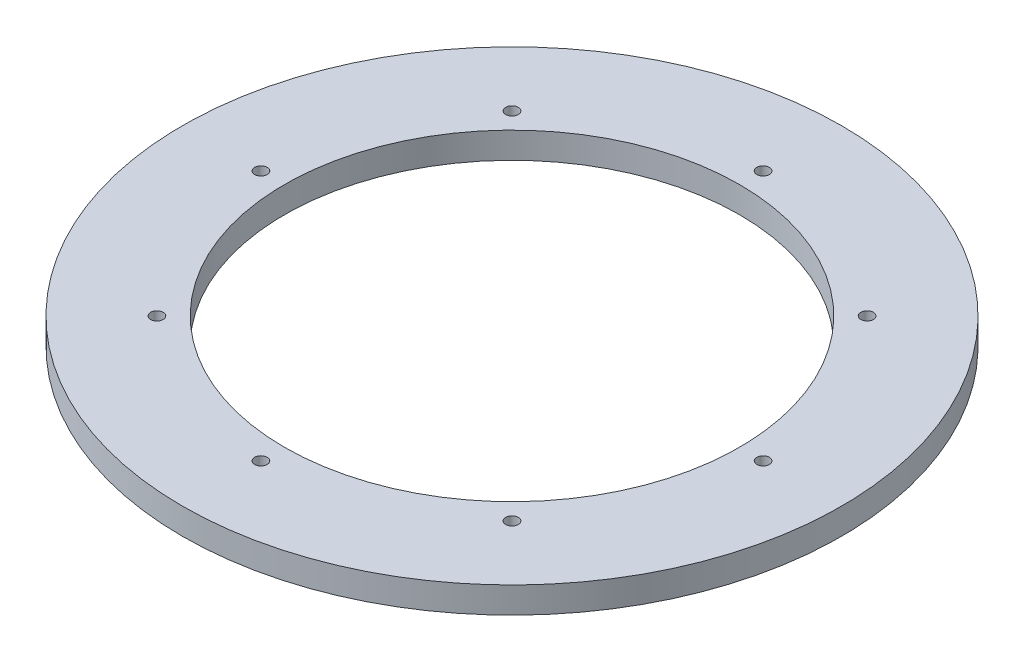
ISO-10303-21;
HEADER;
FILE_DESCRIPTION(('STEP AP214'),'2;1');
FILE_NAME('part.step','',(''),(''),'','','');
FILE_SCHEMA(('AUTOMOTIVE_DESIGN { 1 0 10303 214 1 1 1 1 }'));
ENDSEC;
DATA;
#1=APPLICATION_CONTEXT('core data for automotive mechanical design processes');
#2=APPLICATION_PROTOCOL_DEFINITION('international standard','automotive_design',2000,#1);
#3=PRODUCT_CONTEXT('',#1,'mechanical');
#4=PRODUCT('Part','Part','',(#3));
#5=PRODUCT_RELATED_PRODUCT_CATEGORY('part','',(#4));
#6=PRODUCT_DEFINITION_FORMATION('','',#4);
#7=PRODUCT_DEFINITION_CONTEXT('part definition',#1,'design');
#8=PRODUCT_DEFINITION('design','',#6,#7);
#9=PRODUCT_DEFINITION_SHAPE('','',#8);
#10=(LENGTH_UNIT() NAMED_UNIT(*) SI_UNIT(.MILLI.,.METRE.));
#11=(NAMED_UNIT(*) PLANE_ANGLE_UNIT() SI_UNIT($,.RADIAN.));
#12=(NAMED_UNIT(*) SI_UNIT($,.STERADIAN.) SOLID_ANGLE_UNIT());
#13=UNCERTAINTY_MEASURE_WITH_UNIT(LENGTH_MEASURE(1.E-05),#10,'distance_accuracy_value','');
#14=(GEOMETRIC_REPRESENTATION_CONTEXT(3) GLOBAL_UNCERTAINTY_ASSIGNED_CONTEXT((#13)) GLOBAL_UNIT_ASSIGNED_CONTEXT((#10,
#11,#12)) REPRESENTATION_CONTEXT('',''));
#15=CARTESIAN_POINT('',(0.,0.,0.));
#16=DIRECTION('',(0.,0.,1.));
#17=DIRECTION('',(1.,0.,0.));
#18=AXIS2_PLACEMENT_3D('',#15,#16,#17);
#19=CARTESIAN_POINT('',(0.,12.5,0.));
#20=DIRECTION('',(0.,1.,0.));
#21=DIRECTION('',(0.,0.,1.));
#22=AXIS2_PLACEMENT_3D('',#19,#20,#21);
#23=PLANE('',#22);
#24=CARTESIAN_POINT('',(-240.,12.5,-2.51386656396706E-12));
#25=DIRECTION('',(0.,1.,0.));
#26=DIRECTION('',(0.,0.,1.));
#27=AXIS2_PLACEMENT_3D('',#24,#25,#26);
#28=CIRCLE('',#27,6.);
#29=CARTESIAN_POINT('',(-240.,12.5,5.99999999999749));
#30=VERTEX_POINT('',#29);
#31=EDGE_CURVE('E107',#30,#30,#28,.T.);
#32=ORIENTED_EDGE('',*,*,#31,.F.);
#33=EDGE_LOOP('',(#32));
#34=FACE_BOUND('',#33,.T.);
#35=CARTESIAN_POINT('',(-1.6759110426447E-12,12.5,240.));
#36=DIRECTION('',(0.,1.,0.));
#37=DIRECTION('',(0.,0.,1.));
#38=AXIS2_PLACEMENT_3D('',#35,#36,#37);
#39=CIRCLE('',#38,6.00000000000001);
#40=CARTESIAN_POINT('',(-1.6759110426447E-12,12.5,246.));
#41=VERTEX_POINT('',#40);
#42=EDGE_CURVE('E91',#41,#41,#39,.T.);
#43=ORIENTED_EDGE('',*,*,#42,.F.);
#44=EDGE_LOOP('',(#43));
#45=FACE_BOUND('',#44,.T.);
#46=CARTESIAN_POINT('',(240.,12.5,8.37955521322352E-13));
#47=DIRECTION('',(0.,1.,0.));
#48=DIRECTION('',(0.,0.,1.));
#49=AXIS2_PLACEMENT_3D('',#46,#47,#48);
#50=CIRCLE('',#49,6.);
#51=CARTESIAN_POINT('',(240.,12.5,6.00000000000084));
#52=VERTEX_POINT('',#51);
#53=EDGE_CURVE('E75',#52,#52,#50,.T.);
#54=ORIENTED_EDGE('',*,*,#53,.F.);
#55=EDGE_LOOP('',(#54));
#56=FACE_BOUND('',#55,.T.);
#57=CARTESIAN_POINT('',(0.,12.5,-240.));
#58=DIRECTION('',(0.,1.,0.));
#59=DIRECTION('',(0.,0.,1.));
#60=AXIS2_PLACEMENT_3D('',#57,#58,#59);
#61=CIRCLE('',#60,6.);
#62=CARTESIAN_POINT('',(0.,12.5,-234.));
#63=VERTEX_POINT('',#62);
#64=EDGE_CURVE('E59',#63,#63,#61,.T.);
#65=ORIENTED_EDGE('',*,*,#64,.F.);
#66=EDGE_LOOP('',(#65));
#67=FACE_BOUND('',#66,.T.);
#68=CARTESIAN_POINT('',(0.,12.5,0.));
#69=DIRECTION('',(0.,1.,0.));
#70=DIRECTION('',(0.,0.,1.));
#71=AXIS2_PLACEMENT_3D('',#68,#69,#70);
#72=CIRCLE('',#71,315.);
#73=CARTESIAN_POINT('',(0.,12.5,315.));
#74=VERTEX_POINT('',#73);
#75=EDGE_CURVE('E10',#74,#74,#72,.T.);
#76=ORIENTED_EDGE('',*,*,#75,.T.);
#77=EDGE_LOOP('',(#76));
#78=FACE_BOUND('',#77,.T.);
#79=CARTESIAN_POINT('',(0.,12.5,0.));
#80=DIRECTION('',(0.,1.,0.));
#81=DIRECTION('',(0.,0.,1.));
#82=AXIS2_PLACEMENT_3D('',#79,#80,#81);
#83=CIRCLE('',#82,217.5);
#84=CARTESIAN_POINT('',(0.,12.5,217.5));
#85=VERTEX_POINT('',#84);
#86=EDGE_CURVE('E53',#85,#85,#83,.T.);
#87=ORIENTED_EDGE('',*,*,#86,.F.);
#88=EDGE_LOOP('',(#87));
#89=FACE_BOUND('',#88,.T.);
#90=CARTESIAN_POINT('',(169.705627484772,12.5,-169.705627484771));
#91=DIRECTION('',(0.,1.,0.));
#92=DIRECTION('',(0.,0.,1.));
#93=AXIS2_PLACEMENT_3D('',#90,#91,#92);
#94=CIRCLE('',#93,5.99999999999998);
#95=CARTESIAN_POINT('',(169.705627484772,12.5,-163.705627484771));
#96=VERTEX_POINT('',#95);
#97=EDGE_CURVE('E67',#96,#96,#94,.T.);
#98=ORIENTED_EDGE('',*,*,#97,.F.);
#99=EDGE_LOOP('',(#98));
#100=FACE_BOUND('',#99,.T.);
#101=CARTESIAN_POINT('',(169.70562748477,12.5,169.705627484772));
#102=DIRECTION('',(0.,1.,0.));
#103=DIRECTION('',(0.,0.,1.));
#104=AXIS2_PLACEMENT_3D('',#101,#102,#103);
#105=CIRCLE('',#104,5.99999999999998);
#106=CARTESIAN_POINT('',(169.70562748477,12.5,175.705627484772));
#107=VERTEX_POINT('',#106);
#108=EDGE_CURVE('E83',#107,#107,#105,.T.);
#109=ORIENTED_EDGE('',*,*,#108,.F.);
#110=EDGE_LOOP('',(#109));
#111=FACE_BOUND('',#110,.T.);
#112=CARTESIAN_POINT('',(-169.705627484773,12.5,169.70562748477));
#113=DIRECTION('',(0.,1.,0.));
#114=DIRECTION('',(0.,0.,1.));
#115=AXIS2_PLACEMENT_3D('',#112,#113,#114);
#116=CIRCLE('',#115,6.00000000000001);
#117=CARTESIAN_POINT('',(-169.705627484773,12.5,175.70562748477));
#118=VERTEX_POINT('',#117);
#119=EDGE_CURVE('E99',#118,#118,#116,.T.);
#120=ORIENTED_EDGE('',*,*,#119,.F.);
#121=EDGE_LOOP('',(#120));
#122=FACE_BOUND('',#121,.T.);
#123=CARTESIAN_POINT('',(-169.705627484769,12.5,-169.705627484773));
#124=DIRECTION('',(0.,1.,0.));
#125=DIRECTION('',(0.,0.,1.));
#126=AXIS2_PLACEMENT_3D('',#123,#124,#125);
#127=CIRCLE('',#126,6.00000000000001);
#128=CARTESIAN_POINT('',(-169.705627484769,12.5,-163.705627484773));
#129=VERTEX_POINT('',#128);
#130=EDGE_CURVE('E115',#129,#129,#127,.T.);
#131=ORIENTED_EDGE('',*,*,#130,.F.);
#132=EDGE_LOOP('',(#131));
#133=FACE_BOUND('',#132,.T.);
#134=ADVANCED_FACE('F39',(#34,#45,#56,#67,#78,#89,#100,#111,#122,#133),#23,.T.);
#135=CARTESIAN_POINT('',(0.,-12.5,0.));
#136=DIRECTION('',(0.,1.,0.));
#137=DIRECTION('',(0.,0.,1.));
#138=AXIS2_PLACEMENT_3D('',#135,#136,#137);
#139=PLANE('',#138);
#140=CARTESIAN_POINT('',(0.,-12.5,0.));
#141=DIRECTION('',(0.,1.,0.));
#142=DIRECTION('',(0.,0.,1.));
#143=AXIS2_PLACEMENT_3D('',#140,#141,#142);
#144=CIRCLE('',#143,315.);
#145=CARTESIAN_POINT('',(0.,-12.5,315.));
#146=VERTEX_POINT('',#145);
#147=EDGE_CURVE('E43',#146,#146,#144,.T.);
#148=ORIENTED_EDGE('',*,*,#147,.F.);
#149=EDGE_LOOP('',(#148));
#150=FACE_BOUND('',#149,.T.);
#151=CARTESIAN_POINT('',(0.,-12.5,0.));
#152=DIRECTION('',(0.,1.,0.));
#153=DIRECTION('',(0.,0.,1.));
#154=AXIS2_PLACEMENT_3D('',#151,#152,#153);
#155=CIRCLE('',#154,217.5);
#156=CARTESIAN_POINT('',(0.,-12.5,217.5));
#157=VERTEX_POINT('',#156);
#158=EDGE_CURVE('E55',#157,#157,#155,.T.);
#159=ORIENTED_EDGE('',*,*,#158,.T.);
#160=EDGE_LOOP('',(#159));
#161=FACE_BOUND('',#160,.T.);
#162=CARTESIAN_POINT('',(0.,-12.5,-240.));
#163=DIRECTION('',(0.,1.,0.));
#164=DIRECTION('',(0.,0.,1.));
#165=AXIS2_PLACEMENT_3D('',#162,#163,#164);
#166=CIRCLE('',#165,6.);
#167=CARTESIAN_POINT('',(0.,-12.5,-234.));
#168=VERTEX_POINT('',#167);
#169=EDGE_CURVE('E63',#168,#168,#166,.T.);
#170=ORIENTED_EDGE('',*,*,#169,.T.);
#171=EDGE_LOOP('',(#170));
#172=FACE_BOUND('',#171,.T.);
#173=CARTESIAN_POINT('',(169.705627484772,-12.5,-169.705627484771));
#174=DIRECTION('',(0.,1.,0.));
#175=DIRECTION('',(0.,0.,1.));
#176=AXIS2_PLACEMENT_3D('',#173,#174,#175);
#177=CIRCLE('',#176,5.99999999999998);
#178=CARTESIAN_POINT('',(169.705627484772,-12.5,-163.705627484771));
#179=VERTEX_POINT('',#178);
#180=EDGE_CURVE('E71',#179,#179,#177,.T.);
#181=ORIENTED_EDGE('',*,*,#180,.T.);
#182=EDGE_LOOP('',(#181));
#183=FACE_BOUND('',#182,.T.);
#184=CARTESIAN_POINT('',(240.,-12.5,8.37955521322352E-13));
#185=DIRECTION('',(0.,1.,0.));
#186=DIRECTION('',(0.,0.,1.));
#187=AXIS2_PLACEMENT_3D('',#184,#185,#186);
#188=CIRCLE('',#187,6.);
#189=CARTESIAN_POINT('',(240.,-12.5,6.00000000000084));
#190=VERTEX_POINT('',#189);
#191=EDGE_CURVE('E79',#190,#190,#188,.T.);
#192=ORIENTED_EDGE('',*,*,#191,.T.);
#193=EDGE_LOOP('',(#192));
#194=FACE_BOUND('',#193,.T.);
#195=CARTESIAN_POINT('',(169.70562748477,-12.5,169.705627484772));
#196=DIRECTION('',(0.,1.,0.));
#197=DIRECTION('',(0.,0.,1.));
#198=AXIS2_PLACEMENT_3D('',#195,#196,#197);
#199=CIRCLE('',#198,5.99999999999998);
#200=CARTESIAN_POINT('',(169.70562748477,-12.5,175.705627484772));
#201=VERTEX_POINT('',#200);
#202=EDGE_CURVE('E87',#201,#201,#199,.T.);
#203=ORIENTED_EDGE('',*,*,#202,.T.);
#204=EDGE_LOOP('',(#203));
#205=FACE_BOUND('',#204,.T.);
#206=CARTESIAN_POINT('',(-1.6759110426447E-12,-12.5,240.));
#207=DIRECTION('',(0.,1.,0.));
#208=DIRECTION('',(0.,0.,1.));
#209=AXIS2_PLACEMENT_3D('',#206,#207,#208);
#210=CIRCLE('',#209,6.00000000000001);
#211=CARTESIAN_POINT('',(-1.6759110426447E-12,-12.5,246.));
#212=VERTEX_POINT('',#211);
#213=EDGE_CURVE('E95',#212,#212,#210,.T.);
#214=ORIENTED_EDGE('',*,*,#213,.T.);
#215=EDGE_LOOP('',(#214));
#216=FACE_BOUND('',#215,.T.);
#217=CARTESIAN_POINT('',(-169.705627484773,-12.5,169.70562748477));
#218=DIRECTION('',(0.,1.,0.));
#219=DIRECTION('',(0.,0.,1.));
#220=AXIS2_PLACEMENT_3D('',#217,#218,#219);
#221=CIRCLE('',#220,6.00000000000001);
#222=CARTESIAN_POINT('',(-169.705627484773,-12.5,175.70562748477));
#223=VERTEX_POINT('',#222);
#224=EDGE_CURVE('E103',#223,#223,#221,.T.);
#225=ORIENTED_EDGE('',*,*,#224,.T.);
#226=EDGE_LOOP('',(#225));
#227=FACE_BOUND('',#226,.T.);
#228=CARTESIAN_POINT('',(-240.,-12.5,-2.51386656396706E-12));
#229=DIRECTION('',(0.,1.,0.));
#230=DIRECTION('',(0.,0.,1.));
#231=AXIS2_PLACEMENT_3D('',#228,#229,#230);
#232=CIRCLE('',#231,6.);
#233=CARTESIAN_POINT('',(-240.,-12.5,5.99999999999749));
#234=VERTEX_POINT('',#233);
#235=EDGE_CURVE('E111',#234,#234,#232,.T.);
#236=ORIENTED_EDGE('',*,*,#235,.T.);
#237=EDGE_LOOP('',(#236));
#238=FACE_BOUND('',#237,.T.);
#239=CARTESIAN_POINT('',(-169.705627484769,-12.5,-169.705627484773));
#240=DIRECTION('',(0.,1.,0.));
#241=DIRECTION('',(0.,0.,1.));
#242=AXIS2_PLACEMENT_3D('',#239,#240,#241);
#243=CIRCLE('',#242,6.00000000000001);
#244=CARTESIAN_POINT('',(-169.705627484769,-12.5,-163.705627484773));
#245=VERTEX_POINT('',#244);
#246=EDGE_CURVE('E119',#245,#245,#243,.T.);
#247=ORIENTED_EDGE('',*,*,#246,.T.);
#248=EDGE_LOOP('',(#247));
#249=FACE_BOUND('',#248,.T.);
#250=ADVANCED_FACE('F132',(#150,#161,#172,#183,#194,#205,#216,#227,#238,#249),#139,.F.);
#251=CARTESIAN_POINT('',(0.,12.5,0.));
#252=DIRECTION('',(0.,-1.,0.));
#253=DIRECTION('',(0.,0.,-1.));
#254=AXIS2_PLACEMENT_3D('',#251,#252,#253);
#255=CYLINDRICAL_SURFACE('',#254,315.);
#256=ORIENTED_EDGE('',*,*,#75,.F.);
#257=EDGE_LOOP('',(#256));
#258=FACE_BOUND('',#257,.T.);
#259=ORIENTED_EDGE('',*,*,#147,.T.);
#260=EDGE_LOOP('',(#259));
#261=FACE_BOUND('',#260,.T.);
#262=ADVANCED_FACE('F41',(#258,#261),#255,.T.);
#263=CARTESIAN_POINT('',(0.,12.5,0.));
#264=DIRECTION('',(0.,-1.,0.));
#265=DIRECTION('',(0.,0.,-1.));
#266=AXIS2_PLACEMENT_3D('',#263,#264,#265);
#267=CYLINDRICAL_SURFACE('',#266,217.5);
#268=ORIENTED_EDGE('',*,*,#86,.T.);
#269=EDGE_LOOP('',(#268));
#270=FACE_BOUND('',#269,.T.);
#271=ORIENTED_EDGE('',*,*,#158,.F.);
#272=EDGE_LOOP('',(#271));
#273=FACE_BOUND('',#272,.T.);
#274=ADVANCED_FACE('F142',(#270,#273),#267,.F.);
#275=CARTESIAN_POINT('',(0.,12.5,-240.));
#276=DIRECTION('',(0.,-1.,0.));
#277=DIRECTION('',(0.,0.,-1.));
#278=AXIS2_PLACEMENT_3D('',#275,#276,#277);
#279=CYLINDRICAL_SURFACE('',#278,6.);
#280=ORIENTED_EDGE('',*,*,#64,.T.);
#281=EDGE_LOOP('',(#280));
#282=FACE_BOUND('',#281,.T.);
#283=ORIENTED_EDGE('',*,*,#169,.F.);
#284=EDGE_LOOP('',(#283));
#285=FACE_BOUND('',#284,.T.);
#286=ADVANCED_FACE('F145',(#282,#285),#279,.F.);
#287=CARTESIAN_POINT('',(169.705627484772,12.5,-169.705627484771));
#288=DIRECTION('',(0.,-1.,0.));
#289=DIRECTION('',(0.,0.,-1.));
#290=AXIS2_PLACEMENT_3D('',#287,#288,#289);
#291=CYLINDRICAL_SURFACE('',#290,5.99999999999998);
#292=ORIENTED_EDGE('',*,*,#97,.T.);
#293=EDGE_LOOP('',(#292));
#294=FACE_BOUND('',#293,.T.);
#295=ORIENTED_EDGE('',*,*,#180,.F.);
#296=EDGE_LOOP('',(#295));
#297=FACE_BOUND('',#296,.T.);
#298=ADVANCED_FACE('F149',(#294,#297),#291,.F.);
#299=CARTESIAN_POINT('',(240.,12.5,8.37955521322352E-13));
#300=DIRECTION('',(0.,-1.,0.));
#301=DIRECTION('',(0.,0.,-1.));
#302=AXIS2_PLACEMENT_3D('',#299,#300,#301);
#303=CYLINDRICAL_SURFACE('',#302,6.);
#304=ORIENTED_EDGE('',*,*,#53,.T.);
#305=EDGE_LOOP('',(#304));
#306=FACE_BOUND('',#305,.T.);
#307=ORIENTED_EDGE('',*,*,#191,.F.);
#308=EDGE_LOOP('',(#307));
#309=FACE_BOUND('',#308,.T.);
#310=ADVANCED_FACE('F153',(#306,#309),#303,.F.);
#311=CARTESIAN_POINT('',(169.70562748477,12.5,169.705627484772));
#312=DIRECTION('',(0.,-1.,0.));
#313=DIRECTION('',(0.,0.,-1.));
#314=AXIS2_PLACEMENT_3D('',#311,#312,#313);
#315=CYLINDRICAL_SURFACE('',#314,5.99999999999998);
#316=ORIENTED_EDGE('',*,*,#108,.T.);
#317=EDGE_LOOP('',(#316));
#318=FACE_BOUND('',#317,.T.);
#319=ORIENTED_EDGE('',*,*,#202,.F.);
#320=EDGE_LOOP('',(#319));
#321=FACE_BOUND('',#320,.T.);
#322=ADVANCED_FACE('F157',(#318,#321),#315,.F.);
#323=CARTESIAN_POINT('',(-1.6759110426447E-12,12.5,240.));
#324=DIRECTION('',(0.,-1.,0.));
#325=DIRECTION('',(0.,0.,-1.));
#326=AXIS2_PLACEMENT_3D('',#323,#324,#325);
#327=CYLINDRICAL_SURFACE('',#326,6.00000000000001);
#328=ORIENTED_EDGE('',*,*,#42,.T.);
#329=EDGE_LOOP('',(#328));
#330=FACE_BOUND('',#329,.T.);
#331=ORIENTED_EDGE('',*,*,#213,.F.);
#332=EDGE_LOOP('',(#331));
#333=FACE_BOUND('',#332,.T.);
#334=ADVANCED_FACE('F161',(#330,#333),#327,.F.);
#335=CARTESIAN_POINT('',(-169.705627484773,12.5,169.70562748477));
#336=DIRECTION('',(0.,-1.,0.));
#337=DIRECTION('',(0.,0.,-1.));
#338=AXIS2_PLACEMENT_3D('',#335,#336,#337);
#339=CYLINDRICAL_SURFACE('',#338,6.00000000000001);
#340=ORIENTED_EDGE('',*,*,#119,.T.);
#341=EDGE_LOOP('',(#340));
#342=FACE_BOUND('',#341,.T.);
#343=ORIENTED_EDGE('',*,*,#224,.F.);
#344=EDGE_LOOP('',(#343));
#345=FACE_BOUND('',#344,.T.);
#346=ADVANCED_FACE('F165',(#342,#345),#339,.F.);
#347=CARTESIAN_POINT('',(-240.,12.5,-2.51386656396706E-12));
#348=DIRECTION('',(0.,-1.,0.));
#349=DIRECTION('',(0.,0.,-1.));
#350=AXIS2_PLACEMENT_3D('',#347,#348,#349);
#351=CYLINDRICAL_SURFACE('',#350,6.);
#352=ORIENTED_EDGE('',*,*,#31,.T.);
#353=EDGE_LOOP('',(#352));
#354=FACE_BOUND('',#353,.T.);
#355=ORIENTED_EDGE('',*,*,#235,.F.);
#356=EDGE_LOOP('',(#355));
#357=FACE_BOUND('',#356,.T.);
#358=ADVANCED_FACE('F169',(#354,#357),#351,.F.);
#359=CARTESIAN_POINT('',(-169.705627484769,12.5,-169.705627484773));
#360=DIRECTION('',(0.,-1.,0.));
#361=DIRECTION('',(0.,0.,-1.));
#362=AXIS2_PLACEMENT_3D('',#359,#360,#361);
#363=CYLINDRICAL_SURFACE('',#362,6.00000000000001);
#364=ORIENTED_EDGE('',*,*,#130,.T.);
#365=EDGE_LOOP('',(#364));
#366=FACE_BOUND('',#365,.T.);
#367=ORIENTED_EDGE('',*,*,#246,.F.);
#368=EDGE_LOOP('',(#367));
#369=FACE_BOUND('',#368,.T.);
#370=ADVANCED_FACE('F128',(#366,#369),#363,.F.);
#371=CLOSED_SHELL('',(#134,#250,#262,#274,#286,#298,#310,#322,#334,#346,#358,#370));
#372=MANIFOLD_SOLID_BREP('B2',#371);
#373=ADVANCED_BREP_SHAPE_REPRESENTATION('',(#18,#372),#14);
#374=SHAPE_DEFINITION_REPRESENTATION(#9,#373);
ENDSEC;
END-ISO-10303-21;
